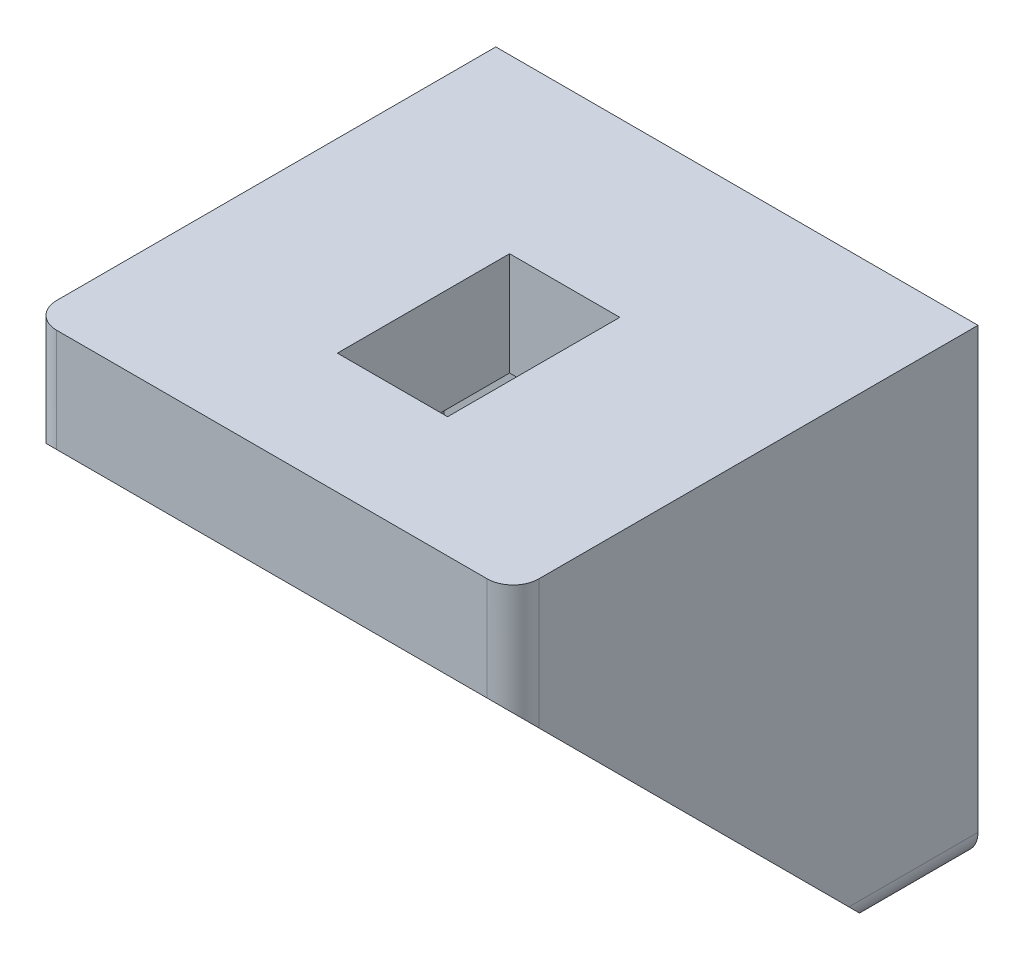
ISO-10303-21;
HEADER;
FILE_DESCRIPTION(('STEP AP214'),'2;1');
FILE_NAME('part.step','',(''),(''),'','','');
FILE_SCHEMA(('AUTOMOTIVE_DESIGN { 1 0 10303 214 1 1 1 1 }'));
ENDSEC;
DATA;
#1=APPLICATION_CONTEXT('core data for automotive mechanical design processes');
#2=APPLICATION_PROTOCOL_DEFINITION('international standard','automotive_design',2000,#1);
#3=PRODUCT_CONTEXT('',#1,'mechanical');
#4=PRODUCT('Part','Part','',(#3));
#5=PRODUCT_RELATED_PRODUCT_CATEGORY('part','',(#4));
#6=PRODUCT_DEFINITION_FORMATION('','',#4);
#7=PRODUCT_DEFINITION_CONTEXT('part definition',#1,'design');
#8=PRODUCT_DEFINITION('design','',#6,#7);
#9=PRODUCT_DEFINITION_SHAPE('','',#8);
#10=(LENGTH_UNIT() NAMED_UNIT(*) SI_UNIT(.MILLI.,.METRE.));
#11=(NAMED_UNIT(*) PLANE_ANGLE_UNIT() SI_UNIT($,.RADIAN.));
#12=(NAMED_UNIT(*) SI_UNIT($,.STERADIAN.) SOLID_ANGLE_UNIT());
#13=UNCERTAINTY_MEASURE_WITH_UNIT(LENGTH_MEASURE(1.E-05),#10,'distance_accuracy_value','');
#14=(GEOMETRIC_REPRESENTATION_CONTEXT(3) GLOBAL_UNCERTAINTY_ASSIGNED_CONTEXT((#13)) GLOBAL_UNIT_ASSIGNED_CONTEXT((#10,
#11,#12)) REPRESENTATION_CONTEXT('',''));
#15=CARTESIAN_POINT('',(0.,0.,0.));
#16=DIRECTION('',(0.,0.,1.));
#17=DIRECTION('',(1.,0.,0.));
#18=AXIS2_PLACEMENT_3D('',#15,#16,#17);
#19=CARTESIAN_POINT('',(11.,0.,0.));
#20=DIRECTION('',(-1.,0.,0.));
#21=DIRECTION('',(0.,0.,1.));
#22=AXIS2_PLACEMENT_3D('',#19,#20,#21);
#23=PLANE('',#22);
#24=DIRECTION('',(0.,-0.707106781186548,-0.707106781186548));
#25=VECTOR('',#24,1.);
#26=CARTESIAN_POINT('',(11.,-27.,6.));
#27=LINE('',#26,#25);
#28=CARTESIAN_POINT('',(11.,-6.,27.));
#29=VERTEX_POINT('',#28);
#30=CARTESIAN_POINT('',(11.,-27.,6.));
#31=VERTEX_POINT('',#30);
#32=EDGE_CURVE('E221',#29,#31,#27,.T.);
#33=ORIENTED_EDGE('',*,*,#32,.F.);
#34=DIRECTION('',(0.,0.,1.));
#35=VECTOR('',#34,1.);
#36=CARTESIAN_POINT('',(11.,-6.,27.));
#37=LINE('',#36,#35);
#38=CARTESIAN_POINT('',(11.,-6.,6.));
#39=VERTEX_POINT('',#38);
#40=EDGE_CURVE('E204',#29,#39,#37,.F.);
#41=ORIENTED_EDGE('',*,*,#40,.T.);
#42=DIRECTION('',(0.,1.,0.));
#43=VECTOR('',#42,1.);
#44=CARTESIAN_POINT('',(11.,-6.,6.));
#45=LINE('',#44,#43);
#46=EDGE_CURVE('E256',#39,#31,#45,.F.);
#47=ORIENTED_EDGE('',*,*,#46,.T.);
#48=EDGE_LOOP('',(#33,#41,#47));
#49=FACE_BOUND('',#48,.T.);
#50=ADVANCED_FACE('F17',(#49),#23,.T.);
#51=CARTESIAN_POINT('',(-11.,0.,0.));
#52=DIRECTION('',(-1.,0.,0.));
#53=DIRECTION('',(0.,0.,1.));
#54=AXIS2_PLACEMENT_3D('',#51,#52,#53);
#55=PLANE('',#54);
#56=DIRECTION('',(0.,-0.707106781186548,-0.707106781186548));
#57=VECTOR('',#56,1.);
#58=CARTESIAN_POINT('',(-11.,-27.,6.));
#59=LINE('',#58,#57);
#60=CARTESIAN_POINT('',(-11.,-27.,6.));
#61=VERTEX_POINT('',#60);
#62=CARTESIAN_POINT('',(-11.,-6.,27.));
#63=VERTEX_POINT('',#62);
#64=EDGE_CURVE('E248',#61,#63,#59,.F.);
#65=ORIENTED_EDGE('',*,*,#64,.F.);
#66=DIRECTION('',(0.,1.,0.));
#67=VECTOR('',#66,1.);
#68=CARTESIAN_POINT('',(-11.,-6.,6.));
#69=LINE('',#68,#67);
#70=CARTESIAN_POINT('',(-11.,-6.,6.));
#71=VERTEX_POINT('',#70);
#72=EDGE_CURVE('E211',#61,#71,#69,.T.);
#73=ORIENTED_EDGE('',*,*,#72,.T.);
#74=DIRECTION('',(0.,0.,1.));
#75=VECTOR('',#74,1.);
#76=CARTESIAN_POINT('',(-11.,-6.,27.));
#77=LINE('',#76,#75);
#78=EDGE_CURVE('E202',#71,#63,#77,.T.);
#79=ORIENTED_EDGE('',*,*,#78,.T.);
#80=EDGE_LOOP('',(#65,#73,#79));
#81=FACE_BOUND('',#80,.T.);
#82=ADVANCED_FACE('F587',(#81),#55,.F.);
#83=CARTESIAN_POINT('',(-11.,-6.,27.));
#84=DIRECTION('',(0.,1.,0.));
#85=DIRECTION('',(0.,0.,1.));
#86=AXIS2_PLACEMENT_3D('',#83,#84,#85);
#87=PLANE('',#86);
#88=DIRECTION('',(1.,0.,0.));
#89=VECTOR('',#88,1.);
#90=CARTESIAN_POINT('',(3.2,-6.,20.));
#91=LINE('',#90,#89);
#92=CARTESIAN_POINT('',(-3.2,-6.,20.));
#93=VERTEX_POINT('',#92);
#94=CARTESIAN_POINT('',(3.2,-6.,20.));
#95=VERTEX_POINT('',#94);
#96=EDGE_CURVE('E181',#93,#95,#91,.T.);
#97=ORIENTED_EDGE('',*,*,#96,.T.);
#98=DIRECTION('',(0.,0.,-1.));
#99=VECTOR('',#98,1.);
#100=CARTESIAN_POINT('',(3.2,-6.,10.));
#101=LINE('',#100,#99);
#102=CARTESIAN_POINT('',(3.2,-6.,10.));
#103=VERTEX_POINT('',#102);
#104=EDGE_CURVE('E189',#95,#103,#101,.T.);
#105=ORIENTED_EDGE('',*,*,#104,.T.);
#106=DIRECTION('',(-1.,0.,0.));
#107=VECTOR('',#106,1.);
#108=CARTESIAN_POINT('',(-3.2,-6.,10.));
#109=LINE('',#108,#107);
#110=CARTESIAN_POINT('',(-3.2,-6.,10.));
#111=VERTEX_POINT('',#110);
#112=EDGE_CURVE('E194',#103,#111,#109,.T.);
#113=ORIENTED_EDGE('',*,*,#112,.T.);
#114=DIRECTION('',(0.,0.,1.));
#115=VECTOR('',#114,1.);
#116=CARTESIAN_POINT('',(-3.2,-6.,20.));
#117=LINE('',#116,#115);
#118=EDGE_CURVE('E199',#111,#93,#117,.T.);
#119=ORIENTED_EDGE('',*,*,#118,.T.);
#120=EDGE_LOOP('',(#97,#105,#113,#119));
#121=FACE_BOUND('',#120,.T.);
#122=ORIENTED_EDGE('',*,*,#40,.F.);
#123=DIRECTION('',(1.,0.,0.));
#124=VECTOR('',#123,1.);
#125=CARTESIAN_POINT('',(14.,-6.,27.));
#126=LINE('',#125,#124);
#127=EDGE_CURVE('E201',#63,#29,#126,.T.);
#128=ORIENTED_EDGE('',*,*,#127,.F.);
#129=ORIENTED_EDGE('',*,*,#78,.F.);
#130=DIRECTION('',(-1.,0.,0.));
#131=VECTOR('',#130,1.);
#132=CARTESIAN_POINT('',(-11.,-6.,6.));
#133=LINE('',#132,#131);
#134=EDGE_CURVE('E207',#71,#39,#133,.F.);
#135=ORIENTED_EDGE('',*,*,#134,.T.);
#136=EDGE_LOOP('',(#122,#128,#129,#135));
#137=FACE_BOUND('',#136,.T.);
#138=ADVANCED_FACE('F579',(#121,#137),#87,.F.);
#139=CARTESIAN_POINT('',(14.,-6.,27.));
#140=DIRECTION('',(0.,0.,1.));
#141=DIRECTION('',(1.,0.,0.));
#142=AXIS2_PLACEMENT_3D('',#139,#140,#141);
#143=PLANE('',#142);
#144=DIRECTION('',(0.,-1.,0.));
#145=VECTOR('',#144,1.);
#146=CARTESIAN_POINT('',(-12.5,-27.03000046861,27.));
#147=LINE('',#146,#145);
#148=CARTESIAN_POINT('',(-12.5,-6.,27.));
#149=VERTEX_POINT('',#148);
#150=CARTESIAN_POINT('',(-12.5,0.,27.));
#151=VERTEX_POINT('',#150);
#152=EDGE_CURVE('E258',#149,#151,#147,.F.);
#153=ORIENTED_EDGE('',*,*,#152,.F.);
#154=DIRECTION('',(1.,0.,0.));
#155=VECTOR('',#154,1.);
#156=CARTESIAN_POINT('',(14.,-6.,27.));
#157=LINE('',#156,#155);
#158=EDGE_CURVE('E249',#63,#149,#157,.F.);
#159=ORIENTED_EDGE('',*,*,#158,.F.);
#160=ORIENTED_EDGE('',*,*,#127,.T.);
#161=DIRECTION('',(1.,0.,0.));
#162=VECTOR('',#161,1.);
#163=CARTESIAN_POINT('',(14.,-6.,27.));
#164=LINE('',#163,#162);
#165=CARTESIAN_POINT('',(12.5,-6.,27.));
#166=VERTEX_POINT('',#165);
#167=EDGE_CURVE('E161',#166,#29,#164,.F.);
#168=ORIENTED_EDGE('',*,*,#167,.F.);
#169=DIRECTION('',(0.,1.,0.));
#170=VECTOR('',#169,1.);
#171=CARTESIAN_POINT('',(12.5,3.030469076153,27.));
#172=LINE('',#171,#170);
#173=CARTESIAN_POINT('',(12.5,0.,27.));
#174=VERTEX_POINT('',#173);
#175=EDGE_CURVE('E157',#174,#166,#172,.F.);
#176=ORIENTED_EDGE('',*,*,#175,.F.);
#177=DIRECTION('',(1.,0.,0.));
#178=VECTOR('',#177,1.);
#179=CARTESIAN_POINT('',(14.,0.,27.));
#180=LINE('',#179,#178);
#181=EDGE_CURVE('E245',#151,#174,#180,.T.);
#182=ORIENTED_EDGE('',*,*,#181,.F.);
#183=EDGE_LOOP('',(#153,#159,#160,#168,#176,#182));
#184=FACE_BOUND('',#183,.T.);
#185=ADVANCED_FACE('F298',(#184),#143,.T.);
#186=CARTESIAN_POINT('',(-3.2,-6.,20.));
#187=DIRECTION('',(-1.,0.,0.));
#188=DIRECTION('',(0.,0.,1.));
#189=AXIS2_PLACEMENT_3D('',#186,#187,#188);
#190=PLANE('',#189);
#191=DIRECTION('',(0.,1.,0.));
#192=VECTOR('',#191,1.);
#193=CARTESIAN_POINT('',(-3.2,-6.,10.));
#194=LINE('',#193,#192);
#195=CARTESIAN_POINT('',(-3.2,0.,10.));
#196=VERTEX_POINT('',#195);
#197=EDGE_CURVE('E197',#111,#196,#194,.T.);
#198=ORIENTED_EDGE('',*,*,#197,.T.);
#199=DIRECTION('',(0.,0.,1.));
#200=VECTOR('',#199,1.);
#201=CARTESIAN_POINT('',(-3.2,0.,27.));
#202=LINE('',#201,#200);
#203=CARTESIAN_POINT('',(-3.2,0.,20.));
#204=VERTEX_POINT('',#203);
#205=EDGE_CURVE('E333',#204,#196,#202,.F.);
#206=ORIENTED_EDGE('',*,*,#205,.F.);
#207=DIRECTION('',(0.,1.,0.));
#208=VECTOR('',#207,1.);
#209=CARTESIAN_POINT('',(-3.2,-6.,20.));
#210=LINE('',#209,#208);
#211=EDGE_CURVE('E184',#204,#93,#210,.F.);
#212=ORIENTED_EDGE('',*,*,#211,.T.);
#213=ORIENTED_EDGE('',*,*,#118,.F.);
#214=EDGE_LOOP('',(#198,#206,#212,#213));
#215=FACE_BOUND('',#214,.T.);
#216=ADVANCED_FACE('F562',(#215),#190,.F.);
#217=CARTESIAN_POINT('',(-3.2,-6.,10.));
#218=DIRECTION('',(0.,0.,-1.));
#219=DIRECTION('',(-1.,0.,0.));
#220=AXIS2_PLACEMENT_3D('',#217,#218,#219);
#221=PLANE('',#220);
#222=DIRECTION('',(0.,1.,0.));
#223=VECTOR('',#222,1.);
#224=CARTESIAN_POINT('',(3.2,-6.,10.));
#225=LINE('',#224,#223);
#226=CARTESIAN_POINT('',(3.2,0.,10.));
#227=VERTEX_POINT('',#226);
#228=EDGE_CURVE('E192',#103,#227,#225,.T.);
#229=ORIENTED_EDGE('',*,*,#228,.T.);
#230=DIRECTION('',(1.,0.,0.));
#231=VECTOR('',#230,1.);
#232=CARTESIAN_POINT('',(14.,0.,10.));
#233=LINE('',#232,#231);
#234=EDGE_CURVE('E331',#196,#227,#233,.T.);
#235=ORIENTED_EDGE('',*,*,#234,.F.);
#236=ORIENTED_EDGE('',*,*,#197,.F.);
#237=ORIENTED_EDGE('',*,*,#112,.F.);
#238=EDGE_LOOP('',(#229,#235,#236,#237));
#239=FACE_BOUND('',#238,.T.);
#240=ADVANCED_FACE('F553',(#239),#221,.F.);
#241=CARTESIAN_POINT('',(3.2,-6.,10.));
#242=DIRECTION('',(1.,0.,0.));
#243=DIRECTION('',(0.,0.,-1.));
#244=AXIS2_PLACEMENT_3D('',#241,#242,#243);
#245=PLANE('',#244);
#246=DIRECTION('',(0.,1.,0.));
#247=VECTOR('',#246,1.);
#248=CARTESIAN_POINT('',(3.2,-6.,20.));
#249=LINE('',#248,#247);
#250=CARTESIAN_POINT('',(3.2,0.,20.));
#251=VERTEX_POINT('',#250);
#252=EDGE_CURVE('E187',#95,#251,#249,.T.);
#253=ORIENTED_EDGE('',*,*,#252,.T.);
#254=DIRECTION('',(0.,0.,1.));
#255=VECTOR('',#254,1.);
#256=CARTESIAN_POINT('',(3.2,0.,27.));
#257=LINE('',#256,#255);
#258=EDGE_CURVE('E328',#227,#251,#257,.T.);
#259=ORIENTED_EDGE('',*,*,#258,.F.);
#260=ORIENTED_EDGE('',*,*,#228,.F.);
#261=ORIENTED_EDGE('',*,*,#104,.F.);
#262=EDGE_LOOP('',(#253,#259,#260,#261));
#263=FACE_BOUND('',#262,.T.);
#264=ADVANCED_FACE('F544',(#263),#245,.F.);
#265=CARTESIAN_POINT('',(3.2,-6.,20.));
#266=DIRECTION('',(0.,0.,1.));
#267=DIRECTION('',(1.,0.,0.));
#268=AXIS2_PLACEMENT_3D('',#265,#266,#267);
#269=PLANE('',#268);
#270=ORIENTED_EDGE('',*,*,#211,.F.);
#271=DIRECTION('',(1.,0.,0.));
#272=VECTOR('',#271,1.);
#273=CARTESIAN_POINT('',(14.,0.,20.));
#274=LINE('',#273,#272);
#275=EDGE_CURVE('E169',#251,#204,#274,.F.);
#276=ORIENTED_EDGE('',*,*,#275,.F.);
#277=ORIENTED_EDGE('',*,*,#252,.F.);
#278=ORIENTED_EDGE('',*,*,#96,.F.);
#279=EDGE_LOOP('',(#270,#276,#277,#278));
#280=FACE_BOUND('',#279,.T.);
#281=ADVANCED_FACE('F536',(#280),#269,.F.);
#282=CARTESIAN_POINT('',(12.5,3.030469076153,25.5));
#283=DIRECTION('',(0.,1.,0.));
#284=DIRECTION('',(0.,0.,1.));
#285=AXIS2_PLACEMENT_3D('',#282,#283,#284);
#286=CYLINDRICAL_SURFACE('',#285,1.5);
#287=DIRECTION('',(0.,1.,0.));
#288=VECTOR('',#287,1.);
#289=CARTESIAN_POINT('',(14.,0.,25.5));
#290=LINE('',#289,#288);
#291=CARTESIAN_POINT('',(14.,-7.5,25.5));
#292=VERTEX_POINT('',#291);
#293=CARTESIAN_POINT('',(14.,0.,25.5));
#294=VERTEX_POINT('',#293);
#295=EDGE_CURVE('E155',#292,#294,#290,.T.);
#296=ORIENTED_EDGE('',*,*,#295,.T.);
#297=CARTESIAN_POINT('',(12.5,0.,25.5));
#298=DIRECTION('',(0.,1.,0.));
#299=DIRECTION('',(0.,0.,1.));
#300=AXIS2_PLACEMENT_3D('',#297,#298,#299);
#301=CIRCLE('',#300,1.5);
#302=EDGE_CURVE('E210',#174,#294,#301,.T.);
#303=ORIENTED_EDGE('',*,*,#302,.F.);
#304=ORIENTED_EDGE('',*,*,#175,.T.);
#305=CARTESIAN_POINT('',(12.5,-7.5,25.5));
#306=DIRECTION('',(0.,-0.707106781186548,0.707106781186548));
#307=DIRECTION('',(0.,0.707106781186548,0.707106781186548));
#308=AXIS2_PLACEMENT_3D('',#305,#306,#307);
#309=ELLIPSE('',#308,2.12132034355964,1.5);
#310=EDGE_CURVE('E20',#292,#166,#309,.T.);
#311=ORIENTED_EDGE('',*,*,#310,.F.);
#312=EDGE_LOOP('',(#296,#303,#304,#311));
#313=FACE_BOUND('',#312,.T.);
#314=ADVANCED_FACE('F152',(#313),#286,.T.);
#315=CARTESIAN_POINT('',(14.,-27.,6.));
#316=DIRECTION('',(0.,-0.707106781186548,0.707106781186548));
#317=DIRECTION('',(0.,-0.707106781186548,-0.707106781186548));
#318=AXIS2_PLACEMENT_3D('',#315,#316,#317);
#319=PLANE('',#318);
#320=DIRECTION('',(1.,0.,0.));
#321=VECTOR('',#320,1.);
#322=CARTESIAN_POINT('',(14.,-27.,6.));
#323=LINE('',#322,#321);
#324=CARTESIAN_POINT('',(12.5,-27.,6.));
#325=VERTEX_POINT('',#324);
#326=EDGE_CURVE('E224',#31,#325,#323,.T.);
#327=ORIENTED_EDGE('',*,*,#326,.T.);
#328=CARTESIAN_POINT('',(12.5,-25.5,7.5));
#329=DIRECTION('',(0.,-0.707106781186548,0.707106781186548));
#330=DIRECTION('',(0.,0.707106781186548,0.707106781186548));
#331=AXIS2_PLACEMENT_3D('',#328,#329,#330);
#332=ELLIPSE('',#331,2.12132034355964,1.5);
#333=CARTESIAN_POINT('',(14.,-25.5,7.5));
#334=VERTEX_POINT('',#333);
#335=EDGE_CURVE('E166',#334,#325,#332,.F.);
#336=ORIENTED_EDGE('',*,*,#335,.F.);
#337=DIRECTION('',(0.,0.707106781186547,0.707106781186547));
#338=VECTOR('',#337,1.);
#339=CARTESIAN_POINT('',(14.,-25.5,7.5));
#340=LINE('',#339,#338);
#341=EDGE_CURVE('E163',#334,#292,#340,.T.);
#342=ORIENTED_EDGE('',*,*,#341,.T.);
#343=ORIENTED_EDGE('',*,*,#310,.T.);
#344=ORIENTED_EDGE('',*,*,#167,.T.);
#345=ORIENTED_EDGE('',*,*,#32,.T.);
#346=EDGE_LOOP('',(#327,#336,#342,#343,#344,#345));
#347=FACE_BOUND('',#346,.T.);
#348=ADVANCED_FACE('F164',(#347),#319,.T.);
#349=CARTESIAN_POINT('',(-12.5,-27.03000046861,25.5));
#350=DIRECTION('',(0.,-1.,0.));
#351=DIRECTION('',(0.,0.,-1.));
#352=AXIS2_PLACEMENT_3D('',#349,#350,#351);
#353=CYLINDRICAL_SURFACE('',#352,1.5);
#354=DIRECTION('',(0.,1.,0.));
#355=VECTOR('',#354,1.);
#356=CARTESIAN_POINT('',(-14.,0.,25.5));
#357=LINE('',#356,#355);
#358=CARTESIAN_POINT('',(-14.,-7.5,25.5));
#359=VERTEX_POINT('',#358);
#360=CARTESIAN_POINT('',(-14.,0.,25.5));
#361=VERTEX_POINT('',#360);
#362=EDGE_CURVE('E238',#359,#361,#357,.T.);
#363=ORIENTED_EDGE('',*,*,#362,.F.);
#364=CARTESIAN_POINT('',(-12.5,-7.5,25.5));
#365=DIRECTION('',(0.,-0.707106781186548,0.707106781186548));
#366=DIRECTION('',(0.,-0.707106781186548,-0.707106781186548));
#367=AXIS2_PLACEMENT_3D('',#364,#365,#366);
#368=ELLIPSE('',#367,2.12132034355964,1.5);
#369=EDGE_CURVE('E246',#149,#359,#368,.T.);
#370=ORIENTED_EDGE('',*,*,#369,.F.);
#371=ORIENTED_EDGE('',*,*,#152,.T.);
#372=CARTESIAN_POINT('',(-12.5,0.,25.5));
#373=DIRECTION('',(0.,-1.,0.));
#374=DIRECTION('',(0.,0.,-1.));
#375=AXIS2_PLACEMENT_3D('',#372,#373,#374);
#376=CIRCLE('',#375,1.5);
#377=EDGE_CURVE('E242',#361,#151,#376,.F.);
#378=ORIENTED_EDGE('',*,*,#377,.F.);
#379=EDGE_LOOP('',(#363,#370,#371,#378));
#380=FACE_BOUND('',#379,.T.);
#381=ADVANCED_FACE('F341',(#380),#353,.T.);
#382=CARTESIAN_POINT('',(14.,-27.,6.));
#383=DIRECTION('',(0.,-0.707106781186548,0.707106781186548));
#384=DIRECTION('',(0.,-0.707106781186548,-0.707106781186548));
#385=AXIS2_PLACEMENT_3D('',#382,#383,#384);
#386=PLANE('',#385);
#387=DIRECTION('',(1.,0.,0.));
#388=VECTOR('',#387,1.);
#389=CARTESIAN_POINT('',(14.,-27.,6.));
#390=LINE('',#389,#388);
#391=CARTESIAN_POINT('',(-12.5,-27.,6.));
#392=VERTEX_POINT('',#391);
#393=EDGE_CURVE('E274',#61,#392,#390,.F.);
#394=ORIENTED_EDGE('',*,*,#393,.F.);
#395=ORIENTED_EDGE('',*,*,#64,.T.);
#396=ORIENTED_EDGE('',*,*,#158,.T.);
#397=ORIENTED_EDGE('',*,*,#369,.T.);
#398=DIRECTION('',(0.,0.707106781186547,0.707106781186547));
#399=VECTOR('',#398,1.);
#400=CARTESIAN_POINT('',(-14.,-25.5,7.5));
#401=LINE('',#400,#399);
#402=CARTESIAN_POINT('',(-14.,-25.5,7.5));
#403=VERTEX_POINT('',#402);
#404=EDGE_CURVE('E267',#403,#359,#401,.T.);
#405=ORIENTED_EDGE('',*,*,#404,.F.);
#406=CARTESIAN_POINT('',(-12.5,-25.5,7.5));
#407=DIRECTION('',(0.,-0.707106781186548,0.707106781186548));
#408=DIRECTION('',(0.,-0.707106781186548,-0.707106781186548));
#409=AXIS2_PLACEMENT_3D('',#406,#407,#408);
#410=ELLIPSE('',#409,2.12132034355964,1.5);
#411=EDGE_CURVE('E236',#392,#403,#410,.F.);
#412=ORIENTED_EDGE('',*,*,#411,.F.);
#413=EDGE_LOOP('',(#394,#395,#396,#397,#405,#412));
#414=FACE_BOUND('',#413,.T.);
#415=ADVANCED_FACE('F348',(#414),#386,.T.);
#416=CARTESIAN_POINT('',(-11.,-6.,6.));
#417=DIRECTION('',(0.,0.,-1.));
#418=DIRECTION('',(-1.,0.,0.));
#419=AXIS2_PLACEMENT_3D('',#416,#417,#418);
#420=PLANE('',#419);
#421=DIRECTION('',(1.,0.,0.));
#422=VECTOR('',#421,1.);
#423=CARTESIAN_POINT('',(3.2,-10.,6.));
#424=LINE('',#423,#422);
#425=CARTESIAN_POINT('',(-3.2,-10.,6.));
#426=VERTEX_POINT('',#425);
#427=CARTESIAN_POINT('',(3.2,-10.,6.));
#428=VERTEX_POINT('',#427);
#429=EDGE_CURVE('E360',#426,#428,#424,.T.);
#430=ORIENTED_EDGE('',*,*,#429,.T.);
#431=DIRECTION('',(0.,1.,0.));
#432=VECTOR('',#431,1.);
#433=CARTESIAN_POINT('',(3.2,-20.,6.));
#434=LINE('',#433,#432);
#435=CARTESIAN_POINT('',(3.2,-20.,6.));
#436=VERTEX_POINT('',#435);
#437=EDGE_CURVE('E373',#428,#436,#434,.F.);
#438=ORIENTED_EDGE('',*,*,#437,.T.);
#439=DIRECTION('',(1.,0.,0.));
#440=VECTOR('',#439,1.);
#441=CARTESIAN_POINT('',(-3.2,-20.,6.));
#442=LINE('',#441,#440);
#443=CARTESIAN_POINT('',(-3.2,-20.,6.));
#444=VERTEX_POINT('',#443);
#445=EDGE_CURVE('E368',#436,#444,#442,.F.);
#446=ORIENTED_EDGE('',*,*,#445,.T.);
#447=DIRECTION('',(0.,1.,0.));
#448=VECTOR('',#447,1.);
#449=CARTESIAN_POINT('',(-3.2,-10.,6.));
#450=LINE('',#449,#448);
#451=EDGE_CURVE('E269',#444,#426,#450,.T.);
#452=ORIENTED_EDGE('',*,*,#451,.T.);
#453=EDGE_LOOP('',(#430,#438,#446,#452));
#454=FACE_BOUND('',#453,.T.);
#455=ORIENTED_EDGE('',*,*,#72,.F.);
#456=DIRECTION('',(1.,0.,0.));
#457=VECTOR('',#456,1.);
#458=CARTESIAN_POINT('',(14.,-27.,6.));
#459=LINE('',#458,#457);
#460=EDGE_CURVE('E276',#31,#61,#459,.F.);
#461=ORIENTED_EDGE('',*,*,#460,.F.);
#462=ORIENTED_EDGE('',*,*,#46,.F.);
#463=ORIENTED_EDGE('',*,*,#134,.F.);
#464=EDGE_LOOP('',(#455,#461,#462,#463));
#465=FACE_BOUND('',#464,.T.);
#466=ADVANCED_FACE('F309',(#454,#465),#420,.F.);
#467=CARTESIAN_POINT('',(14.,0.,27.));
#468=DIRECTION('',(0.,1.,0.));
#469=DIRECTION('',(0.,0.,1.));
#470=AXIS2_PLACEMENT_3D('',#467,#468,#469);
#471=PLANE('',#470);
#472=ORIENTED_EDGE('',*,*,#258,.T.);
#473=ORIENTED_EDGE('',*,*,#275,.T.);
#474=ORIENTED_EDGE('',*,*,#205,.T.);
#475=ORIENTED_EDGE('',*,*,#234,.T.);
#476=EDGE_LOOP('',(#472,#473,#474,#475));
#477=FACE_BOUND('',#476,.T.);
#478=ORIENTED_EDGE('',*,*,#377,.T.);
#479=ORIENTED_EDGE('',*,*,#181,.T.);
#480=ORIENTED_EDGE('',*,*,#302,.T.);
#481=DIRECTION('',(0.,0.,1.));
#482=VECTOR('',#481,1.);
#483=CARTESIAN_POINT('',(14.,0.,0.));
#484=LINE('',#483,#482);
#485=CARTESIAN_POINT('',(14.,0.,0.));
#486=VERTEX_POINT('',#485);
#487=EDGE_CURVE('E174',#294,#486,#484,.F.);
#488=ORIENTED_EDGE('',*,*,#487,.T.);
#489=DIRECTION('',(-1.,0.,0.));
#490=VECTOR('',#489,1.);
#491=CARTESIAN_POINT('',(14.,0.,0.));
#492=LINE('',#491,#490);
#493=CARTESIAN_POINT('',(-14.,0.,0.));
#494=VERTEX_POINT('',#493);
#495=EDGE_CURVE('E357',#494,#486,#492,.F.);
#496=ORIENTED_EDGE('',*,*,#495,.F.);
#497=DIRECTION('',(0.,0.,1.));
#498=VECTOR('',#497,1.);
#499=CARTESIAN_POINT('',(-14.,0.,0.));
#500=LINE('',#499,#498);
#501=EDGE_CURVE('E272',#361,#494,#500,.F.);
#502=ORIENTED_EDGE('',*,*,#501,.F.);
#503=EDGE_LOOP('',(#478,#479,#480,#488,#496,#502));
#504=FACE_BOUND('',#503,.T.);
#505=ADVANCED_FACE('F338',(#477,#504),#471,.T.);
#506=CARTESIAN_POINT('',(14.,0.,0.));
#507=DIRECTION('',(-1.,0.,0.));
#508=DIRECTION('',(0.,0.,1.));
#509=AXIS2_PLACEMENT_3D('',#506,#507,#508);
#510=PLANE('',#509);
#511=DIRECTION('',(0.,1.,0.));
#512=VECTOR('',#511,1.);
#513=CARTESIAN_POINT('',(14.,0.,0.));
#514=LINE('',#513,#512);
#515=CARTESIAN_POINT('',(14.,-25.5,0.));
#516=VERTEX_POINT('',#515);
#517=EDGE_CURVE('E235',#486,#516,#514,.F.);
#518=ORIENTED_EDGE('',*,*,#517,.F.);
#519=ORIENTED_EDGE('',*,*,#487,.F.);
#520=ORIENTED_EDGE('',*,*,#295,.F.);
#521=ORIENTED_EDGE('',*,*,#341,.F.);
#522=DIRECTION('',(0.,0.,1.));
#523=VECTOR('',#522,1.);
#524=CARTESIAN_POINT('',(14.,-25.5,27.0300003324));
#525=LINE('',#524,#523);
#526=EDGE_CURVE('E176',#516,#334,#525,.T.);
#527=ORIENTED_EDGE('',*,*,#526,.F.);
#528=EDGE_LOOP('',(#518,#519,#520,#521,#527));
#529=FACE_BOUND('',#528,.T.);
#530=ADVANCED_FACE('F173',(#529),#510,.F.);
#531=CARTESIAN_POINT('',(12.5,-25.5,27.0300003324));
#532=DIRECTION('',(0.,0.,1.));
#533=DIRECTION('',(1.,0.,0.));
#534=AXIS2_PLACEMENT_3D('',#531,#532,#533);
#535=CYLINDRICAL_SURFACE('',#534,1.5);
#536=ORIENTED_EDGE('',*,*,#526,.T.);
#537=ORIENTED_EDGE('',*,*,#335,.T.);
#538=DIRECTION('',(0.,0.,-1.));
#539=VECTOR('',#538,1.);
#540=CARTESIAN_POINT('',(12.5,-27.,0.));
#541=LINE('',#540,#539);
#542=CARTESIAN_POINT('',(12.5,-27.,0.));
#543=VERTEX_POINT('',#542);
#544=EDGE_CURVE('E241',#543,#325,#541,.F.);
#545=ORIENTED_EDGE('',*,*,#544,.F.);
#546=CARTESIAN_POINT('',(12.5,-25.5,0.));
#547=DIRECTION('',(0.,0.,1.));
#548=DIRECTION('',(1.,0.,0.));
#549=AXIS2_PLACEMENT_3D('',#546,#547,#548);
#550=CIRCLE('',#549,1.5);
#551=EDGE_CURVE('E232',#516,#543,#550,.F.);
#552=ORIENTED_EDGE('',*,*,#551,.F.);
#553=EDGE_LOOP('',(#536,#537,#545,#552));
#554=FACE_BOUND('',#553,.T.);
#555=ADVANCED_FACE('F317',(#554),#535,.T.);
#556=CARTESIAN_POINT('',(14.,-27.,0.));
#557=DIRECTION('',(0.,-1.,0.));
#558=DIRECTION('',(0.,0.,-1.));
#559=AXIS2_PLACEMENT_3D('',#556,#557,#558);
#560=PLANE('',#559);
#561=DIRECTION('',(0.,0.,-1.));
#562=VECTOR('',#561,1.);
#563=CARTESIAN_POINT('',(-12.5,-27.,-3.0303327324));
#564=LINE('',#563,#562);
#565=CARTESIAN_POINT('',(-12.5,-27.,0.));
#566=VERTEX_POINT('',#565);
#567=EDGE_CURVE('E239',#566,#392,#564,.F.);
#568=ORIENTED_EDGE('',*,*,#567,.F.);
#569=DIRECTION('',(-1.,0.,0.));
#570=VECTOR('',#569,1.);
#571=CARTESIAN_POINT('',(14.,-27.,0.));
#572=LINE('',#571,#570);
#573=EDGE_CURVE('E231',#543,#566,#572,.T.);
#574=ORIENTED_EDGE('',*,*,#573,.F.);
#575=ORIENTED_EDGE('',*,*,#544,.T.);
#576=ORIENTED_EDGE('',*,*,#326,.F.);
#577=ORIENTED_EDGE('',*,*,#460,.T.);
#578=ORIENTED_EDGE('',*,*,#393,.T.);
#579=EDGE_LOOP('',(#568,#574,#575,#576,#577,#578));
#580=FACE_BOUND('',#579,.T.);
#581=ADVANCED_FACE('F312',(#580),#560,.T.);
#582=CARTESIAN_POINT('',(-12.5,-25.5,-3.0303327324));
#583=DIRECTION('',(0.,0.,-1.));
#584=DIRECTION('',(-1.,0.,0.));
#585=AXIS2_PLACEMENT_3D('',#582,#583,#584);
#586=CYLINDRICAL_SURFACE('',#585,1.5);
#587=DIRECTION('',(0.,0.,1.));
#588=VECTOR('',#587,1.);
#589=CARTESIAN_POINT('',(-14.,-25.5,0.));
#590=LINE('',#589,#588);
#591=CARTESIAN_POINT('',(-14.,-25.5,0.));
#592=VERTEX_POINT('',#591);
#593=EDGE_CURVE('E270',#592,#403,#590,.T.);
#594=ORIENTED_EDGE('',*,*,#593,.F.);
#595=CARTESIAN_POINT('',(-12.5,-25.5,0.));
#596=DIRECTION('',(0.,0.,-1.));
#597=DIRECTION('',(-1.,0.,0.));
#598=AXIS2_PLACEMENT_3D('',#595,#596,#597);
#599=CIRCLE('',#598,1.5);
#600=EDGE_CURVE('E227',#566,#592,#599,.T.);
#601=ORIENTED_EDGE('',*,*,#600,.F.);
#602=ORIENTED_EDGE('',*,*,#567,.T.);
#603=ORIENTED_EDGE('',*,*,#411,.T.);
#604=EDGE_LOOP('',(#594,#601,#602,#603));
#605=FACE_BOUND('',#604,.T.);
#606=ADVANCED_FACE('F352',(#605),#586,.T.);
#607=CARTESIAN_POINT('',(-14.,0.,0.));
#608=DIRECTION('',(-1.,0.,0.));
#609=DIRECTION('',(0.,0.,1.));
#610=AXIS2_PLACEMENT_3D('',#607,#608,#609);
#611=PLANE('',#610);
#612=ORIENTED_EDGE('',*,*,#593,.T.);
#613=ORIENTED_EDGE('',*,*,#404,.T.);
#614=ORIENTED_EDGE('',*,*,#362,.T.);
#615=ORIENTED_EDGE('',*,*,#501,.T.);
#616=DIRECTION('',(0.,1.,0.));
#617=VECTOR('',#616,1.);
#618=CARTESIAN_POINT('',(-14.,0.,0.));
#619=LINE('',#618,#617);
#620=EDGE_CURVE('E230',#592,#494,#619,.T.);
#621=ORIENTED_EDGE('',*,*,#620,.F.);
#622=EDGE_LOOP('',(#612,#613,#614,#615,#621));
#623=FACE_BOUND('',#622,.T.);
#624=ADVANCED_FACE('F345',(#623),#611,.T.);
#625=CARTESIAN_POINT('',(-3.2,-10.,6.));
#626=DIRECTION('',(-1.,0.,0.));
#627=DIRECTION('',(0.,0.,1.));
#628=AXIS2_PLACEMENT_3D('',#625,#626,#627);
#629=PLANE('',#628);
#630=DIRECTION('',(0.,0.,-1.));
#631=VECTOR('',#630,1.);
#632=CARTESIAN_POINT('',(-3.2,-20.,6.));
#633=LINE('',#632,#631);
#634=CARTESIAN_POINT('',(-3.2,-20.,0.));
#635=VERTEX_POINT('',#634);
#636=EDGE_CURVE('E366',#444,#635,#633,.T.);
#637=ORIENTED_EDGE('',*,*,#636,.T.);
#638=DIRECTION('',(0.,1.,0.));
#639=VECTOR('',#638,1.);
#640=CARTESIAN_POINT('',(-3.2,0.,0.));
#641=LINE('',#640,#639);
#642=CARTESIAN_POINT('',(-3.2,-10.,0.));
#643=VERTEX_POINT('',#642);
#644=EDGE_CURVE('E389',#643,#635,#641,.F.);
#645=ORIENTED_EDGE('',*,*,#644,.F.);
#646=DIRECTION('',(0.,0.,1.));
#647=VECTOR('',#646,1.);
#648=CARTESIAN_POINT('',(-3.2,-10.,6.));
#649=LINE('',#648,#647);
#650=EDGE_CURVE('E377',#643,#426,#649,.T.);
#651=ORIENTED_EDGE('',*,*,#650,.T.);
#652=ORIENTED_EDGE('',*,*,#451,.F.);
#653=EDGE_LOOP('',(#637,#645,#651,#652));
#654=FACE_BOUND('',#653,.T.);
#655=ADVANCED_FACE('F411',(#654),#629,.F.);
#656=CARTESIAN_POINT('',(-3.2,-20.,6.));
#657=DIRECTION('',(0.,-1.,0.));
#658=DIRECTION('',(0.,0.,-1.));
#659=AXIS2_PLACEMENT_3D('',#656,#657,#658);
#660=PLANE('',#659);
#661=DIRECTION('',(0.,0.,-1.));
#662=VECTOR('',#661,1.);
#663=CARTESIAN_POINT('',(3.2,-20.,6.));
#664=LINE('',#663,#662);
#665=CARTESIAN_POINT('',(3.2,-20.,0.));
#666=VERTEX_POINT('',#665);
#667=EDGE_CURVE('E371',#436,#666,#664,.T.);
#668=ORIENTED_EDGE('',*,*,#667,.T.);
#669=DIRECTION('',(-1.,0.,0.));
#670=VECTOR('',#669,1.);
#671=CARTESIAN_POINT('',(14.,-20.,0.));
#672=LINE('',#671,#670);
#673=EDGE_CURVE('E392',#635,#666,#672,.F.);
#674=ORIENTED_EDGE('',*,*,#673,.F.);
#675=ORIENTED_EDGE('',*,*,#636,.F.);
#676=ORIENTED_EDGE('',*,*,#445,.F.);
#677=EDGE_LOOP('',(#668,#674,#675,#676));
#678=FACE_BOUND('',#677,.T.);
#679=ADVANCED_FACE('F403',(#678),#660,.F.);
#680=CARTESIAN_POINT('',(3.2,-20.,6.));
#681=DIRECTION('',(1.,0.,0.));
#682=DIRECTION('',(0.,0.,-1.));
#683=AXIS2_PLACEMENT_3D('',#680,#681,#682);
#684=PLANE('',#683);
#685=DIRECTION('',(0.,0.,1.));
#686=VECTOR('',#685,1.);
#687=CARTESIAN_POINT('',(3.2,-10.,6.));
#688=LINE('',#687,#686);
#689=CARTESIAN_POINT('',(3.2,-10.,0.));
#690=VERTEX_POINT('',#689);
#691=EDGE_CURVE('E35',#428,#690,#688,.F.);
#692=ORIENTED_EDGE('',*,*,#691,.T.);
#693=DIRECTION('',(0.,1.,0.));
#694=VECTOR('',#693,1.);
#695=CARTESIAN_POINT('',(3.2,0.,0.));
#696=LINE('',#695,#694);
#697=EDGE_CURVE('E26',#666,#690,#696,.T.);
#698=ORIENTED_EDGE('',*,*,#697,.F.);
#699=ORIENTED_EDGE('',*,*,#667,.F.);
#700=ORIENTED_EDGE('',*,*,#437,.F.);
#701=EDGE_LOOP('',(#692,#698,#699,#700));
#702=FACE_BOUND('',#701,.T.);
#703=ADVANCED_FACE('F401',(#702),#684,.F.);
#704=CARTESIAN_POINT('',(3.2,-10.,6.));
#705=DIRECTION('',(0.,1.,0.));
#706=DIRECTION('',(0.,0.,1.));
#707=AXIS2_PLACEMENT_3D('',#704,#705,#706);
#708=PLANE('',#707);
#709=ORIENTED_EDGE('',*,*,#650,.F.);
#710=DIRECTION('',(-1.,0.,0.));
#711=VECTOR('',#710,1.);
#712=CARTESIAN_POINT('',(14.,-10.,0.));
#713=LINE('',#712,#711);
#714=EDGE_CURVE('E11',#690,#643,#713,.T.);
#715=ORIENTED_EDGE('',*,*,#714,.F.);
#716=ORIENTED_EDGE('',*,*,#691,.F.);
#717=ORIENTED_EDGE('',*,*,#429,.F.);
#718=EDGE_LOOP('',(#709,#715,#716,#717));
#719=FACE_BOUND('',#718,.T.);
#720=ADVANCED_FACE('F409',(#719),#708,.F.);
#721=CARTESIAN_POINT('',(14.,0.,0.));
#722=DIRECTION('',(0.,0.,-1.));
#723=DIRECTION('',(-1.,0.,0.));
#724=AXIS2_PLACEMENT_3D('',#721,#722,#723);
#725=PLANE('',#724);
#726=ORIENTED_EDGE('',*,*,#697,.T.);
#727=ORIENTED_EDGE('',*,*,#714,.T.);
#728=ORIENTED_EDGE('',*,*,#644,.T.);
#729=ORIENTED_EDGE('',*,*,#673,.T.);
#730=EDGE_LOOP('',(#726,#727,#728,#729));
#731=FACE_BOUND('',#730,.T.);
#732=ORIENTED_EDGE('',*,*,#600,.T.);
#733=ORIENTED_EDGE('',*,*,#620,.T.);
#734=ORIENTED_EDGE('',*,*,#495,.T.);
#735=ORIENTED_EDGE('',*,*,#517,.T.);
#736=ORIENTED_EDGE('',*,*,#551,.T.);
#737=ORIENTED_EDGE('',*,*,#573,.T.);
#738=EDGE_LOOP('',(#732,#733,#734,#735,#736,#737));
#739=FACE_BOUND('',#738,.T.);
#740=ADVANCED_FACE('F397',(#731,#739),#725,.T.);
#741=CLOSED_SHELL('',(#50,#82,#138,#185,#216,#240,#264,#281,#314,#348,#381,#415,#466,#505,#530,
#555,#581,#606,#624,#655,#679,#703,#720,#740));
#742=MANIFOLD_SOLID_BREP('B1',#741);
#743=ADVANCED_BREP_SHAPE_REPRESENTATION('',(#18,#742),#14);
#744=SHAPE_DEFINITION_REPRESENTATION(#9,#743);
ENDSEC;
END-ISO-10303-21;
